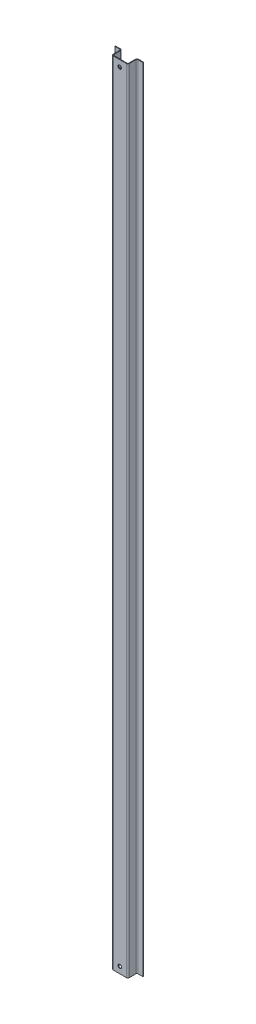
ISO-10303-21;
HEADER;
FILE_DESCRIPTION(('STEP AP214'),'2;1');
FILE_NAME('part.step','',(''),(''),'','','');
FILE_SCHEMA(('AUTOMOTIVE_DESIGN { 1 0 10303 214 1 1 1 1 }'));
ENDSEC;
DATA;
#1=APPLICATION_CONTEXT('core data for automotive mechanical design processes');
#2=APPLICATION_PROTOCOL_DEFINITION('international standard','automotive_design',2000,#1);
#3=PRODUCT_CONTEXT('',#1,'mechanical');
#4=PRODUCT('Part','Part','',(#3));
#5=PRODUCT_RELATED_PRODUCT_CATEGORY('part','',(#4));
#6=PRODUCT_DEFINITION_FORMATION('','',#4);
#7=PRODUCT_DEFINITION_CONTEXT('part definition',#1,'design');
#8=PRODUCT_DEFINITION('design','',#6,#7);
#9=PRODUCT_DEFINITION_SHAPE('','',#8);
#10=(LENGTH_UNIT() NAMED_UNIT(*) SI_UNIT(.MILLI.,.METRE.));
#11=(NAMED_UNIT(*) PLANE_ANGLE_UNIT() SI_UNIT($,.RADIAN.));
#12=(NAMED_UNIT(*) SI_UNIT($,.STERADIAN.) SOLID_ANGLE_UNIT());
#13=UNCERTAINTY_MEASURE_WITH_UNIT(LENGTH_MEASURE(1.E-05),#10,'distance_accuracy_value','');
#14=(GEOMETRIC_REPRESENTATION_CONTEXT(3) GLOBAL_UNCERTAINTY_ASSIGNED_CONTEXT((#13)) GLOBAL_UNIT_ASSIGNED_CONTEXT((#10,
#11,#12)) REPRESENTATION_CONTEXT('',''));
#15=CARTESIAN_POINT('',(0.,0.,0.));
#16=DIRECTION('',(0.,0.,1.));
#17=DIRECTION('',(1.,0.,0.));
#18=AXIS2_PLACEMENT_3D('',#15,#16,#17);
#19=CARTESIAN_POINT('',(25.0000000000001,1221.5,-30.));
#20=DIRECTION('',(0.,1.,0.));
#21=DIRECTION('',(0.,0.,1.));
#22=AXIS2_PLACEMENT_3D('',#19,#20,#21);
#23=PLANE('',#22);
#24=DIRECTION('',(0.,0.,-1.));
#25=VECTOR('',#24,1.);
#26=CARTESIAN_POINT('',(25.0000000000001,1221.5,-30.));
#27=LINE('',#26,#25);
#28=CARTESIAN_POINT('',(25.,1221.5,-4.5));
#29=VERTEX_POINT('',#28);
#30=CARTESIAN_POINT('',(25.0000000000001,1221.5,-25.5));
#31=VERTEX_POINT('',#30);
#32=EDGE_CURVE('E422',#29,#31,#27,.T.);
#33=ORIENTED_EDGE('',*,*,#32,.T.);
#34=DIRECTION('',(-1.,0.,0.));
#35=VECTOR('',#34,1.);
#36=CARTESIAN_POINT('',(25.,1221.5,-25.5));
#37=LINE('',#36,#35);
#38=CARTESIAN_POINT('',(23.,1221.5,-25.5));
#39=VERTEX_POINT('',#38);
#40=EDGE_CURVE('E309',#31,#39,#37,.T.);
#41=ORIENTED_EDGE('',*,*,#40,.T.);
#42=DIRECTION('',(0.,0.,1.));
#43=VECTOR('',#42,1.);
#44=CARTESIAN_POINT('',(23.,1221.5,0.));
#45=LINE('',#44,#43);
#46=CARTESIAN_POINT('',(23.,1221.5,-4.50000000000001));
#47=VERTEX_POINT('',#46);
#48=EDGE_CURVE('E426',#47,#39,#45,.F.);
#49=ORIENTED_EDGE('',*,*,#48,.F.);
#50=DIRECTION('',(1.,0.,0.));
#51=VECTOR('',#50,1.);
#52=CARTESIAN_POINT('',(25.,1221.5,-4.49999999999999));
#53=LINE('',#52,#51);
#54=EDGE_CURVE('E416',#47,#29,#53,.T.);
#55=ORIENTED_EDGE('',*,*,#54,.T.);
#56=EDGE_LOOP('',(#33,#41,#49,#55));
#57=FACE_BOUND('',#56,.T.);
#58=ADVANCED_FACE('F120',(#57),#23,.T.);
#59=CARTESIAN_POINT('',(25.,0.,0.));
#60=DIRECTION('',(1.,0.,0.));
#61=DIRECTION('',(0.,0.,-1.));
#62=AXIS2_PLACEMENT_3D('',#59,#60,#61);
#63=PLANE('',#62);
#64=DIRECTION('',(0.,0.,1.));
#65=VECTOR('',#64,1.);
#66=CARTESIAN_POINT('',(25.,-1221.5,-1.99999999999999));
#67=LINE('',#66,#65);
#68=CARTESIAN_POINT('',(25.0000000000001,-1221.5,-25.5));
#69=VERTEX_POINT('',#68);
#70=CARTESIAN_POINT('',(25.,-1221.5,-4.50000000000002));
#71=VERTEX_POINT('',#70);
#72=EDGE_CURVE('E419',#69,#71,#67,.T.);
#73=ORIENTED_EDGE('',*,*,#72,.F.);
#74=DIRECTION('',(0.,1.,0.));
#75=VECTOR('',#74,1.);
#76=CARTESIAN_POINT('',(25.,1221.5,-25.5));
#77=LINE('',#76,#75);
#78=EDGE_CURVE('E144',#31,#69,#77,.F.);
#79=ORIENTED_EDGE('',*,*,#78,.F.);
#80=ORIENTED_EDGE('',*,*,#32,.F.);
#81=DIRECTION('',(0.,-1.,0.));
#82=VECTOR('',#81,1.);
#83=CARTESIAN_POINT('',(25.,0.,-4.5));
#84=LINE('',#83,#82);
#85=EDGE_CURVE('E429',#29,#71,#84,.T.);
#86=ORIENTED_EDGE('',*,*,#85,.T.);
#87=EDGE_LOOP('',(#73,#79,#80,#86));
#88=FACE_BOUND('',#87,.T.);
#89=ADVANCED_FACE('F516',(#88),#63,.T.);
#90=CARTESIAN_POINT('',(23.,0.,0.));
#91=DIRECTION('',(1.,0.,0.));
#92=DIRECTION('',(0.,0.,-1.));
#93=AXIS2_PLACEMENT_3D('',#90,#91,#92);
#94=PLANE('',#93);
#95=DIRECTION('',(0.,1.,0.));
#96=VECTOR('',#95,1.);
#97=CARTESIAN_POINT('',(23.,1221.5,-25.5));
#98=LINE('',#97,#96);
#99=CARTESIAN_POINT('',(23.0000000000001,-1221.5,-25.5));
#100=VERTEX_POINT('',#99);
#101=EDGE_CURVE('E303',#39,#100,#98,.F.);
#102=ORIENTED_EDGE('',*,*,#101,.T.);
#103=DIRECTION('',(0.,0.,-1.));
#104=VECTOR('',#103,1.);
#105=CARTESIAN_POINT('',(23.,-1221.5,0.));
#106=LINE('',#105,#104);
#107=CARTESIAN_POINT('',(23.,-1221.5,-4.50000000000001));
#108=VERTEX_POINT('',#107);
#109=EDGE_CURVE('E424',#100,#108,#106,.F.);
#110=ORIENTED_EDGE('',*,*,#109,.T.);
#111=DIRECTION('',(0.,1.,0.));
#112=VECTOR('',#111,1.);
#113=CARTESIAN_POINT('',(23.,1221.5,-4.49999999999999));
#114=LINE('',#113,#112);
#115=EDGE_CURVE('E435',#47,#108,#114,.F.);
#116=ORIENTED_EDGE('',*,*,#115,.F.);
#117=ORIENTED_EDGE('',*,*,#48,.T.);
#118=EDGE_LOOP('',(#102,#110,#116,#117));
#119=FACE_BOUND('',#118,.T.);
#120=ADVANCED_FACE('F497',(#119),#94,.F.);
#121=CARTESIAN_POINT('',(-25.0000000000001,-1221.5,-30.));
#122=DIRECTION('',(0.,-1.,0.));
#123=DIRECTION('',(0.,0.,-1.));
#124=AXIS2_PLACEMENT_3D('',#121,#122,#123);
#125=PLANE('',#124);
#126=DIRECTION('',(0.,0.,-1.));
#127=VECTOR('',#126,1.);
#128=CARTESIAN_POINT('',(-25.0000000000001,-1221.5,-30.));
#129=LINE('',#128,#127);
#130=CARTESIAN_POINT('',(-25.,-1221.5,-4.49999999999997));
#131=VERTEX_POINT('',#130);
#132=CARTESIAN_POINT('',(-25.0000000000001,-1221.5,-25.5));
#133=VERTEX_POINT('',#132);
#134=EDGE_CURVE('E377',#131,#133,#129,.T.);
#135=ORIENTED_EDGE('',*,*,#134,.T.);
#136=DIRECTION('',(1.,0.,0.));
#137=VECTOR('',#136,1.);
#138=CARTESIAN_POINT('',(-25.0000000000001,-1221.5,-25.5));
#139=LINE('',#138,#137);
#140=CARTESIAN_POINT('',(-23.0000000000001,-1221.5,-25.5));
#141=VERTEX_POINT('',#140);
#142=EDGE_CURVE('E358',#133,#141,#139,.T.);
#143=ORIENTED_EDGE('',*,*,#142,.T.);
#144=DIRECTION('',(0.,0.,1.));
#145=VECTOR('',#144,1.);
#146=CARTESIAN_POINT('',(-23.,-1221.5,0.));
#147=LINE('',#146,#145);
#148=CARTESIAN_POINT('',(-23.,-1221.5,-4.49999999999998));
#149=VERTEX_POINT('',#148);
#150=EDGE_CURVE('E382',#149,#141,#147,.F.);
#151=ORIENTED_EDGE('',*,*,#150,.F.);
#152=DIRECTION('',(-1.,0.,0.));
#153=VECTOR('',#152,1.);
#154=CARTESIAN_POINT('',(-25.,-1221.5,-4.49999999999999));
#155=LINE('',#154,#153);
#156=EDGE_CURVE('E372',#149,#131,#155,.T.);
#157=ORIENTED_EDGE('',*,*,#156,.T.);
#158=EDGE_LOOP('',(#135,#143,#151,#157));
#159=FACE_BOUND('',#158,.T.);
#160=ADVANCED_FACE('F574',(#159),#125,.T.);
#161=CARTESIAN_POINT('',(-25.,0.,0.));
#162=DIRECTION('',(-1.,0.,0.));
#163=DIRECTION('',(0.,0.,1.));
#164=AXIS2_PLACEMENT_3D('',#161,#162,#163);
#165=PLANE('',#164);
#166=DIRECTION('',(0.,0.,1.));
#167=VECTOR('',#166,1.);
#168=CARTESIAN_POINT('',(-25.,1221.5,-1.99999999999999));
#169=LINE('',#168,#167);
#170=CARTESIAN_POINT('',(-25.0000000000001,1221.5,-25.5));
#171=VERTEX_POINT('',#170);
#172=CARTESIAN_POINT('',(-25.,1221.5,-4.49999999999995));
#173=VERTEX_POINT('',#172);
#174=EDGE_CURVE('E374',#171,#173,#169,.T.);
#175=ORIENTED_EDGE('',*,*,#174,.F.);
#176=DIRECTION('',(0.,-1.,0.));
#177=VECTOR('',#176,1.);
#178=CARTESIAN_POINT('',(-25.0000000000001,-1221.5,-25.5));
#179=LINE('',#178,#177);
#180=EDGE_CURVE('E364',#133,#171,#179,.F.);
#181=ORIENTED_EDGE('',*,*,#180,.F.);
#182=ORIENTED_EDGE('',*,*,#134,.F.);
#183=DIRECTION('',(0.,1.,0.));
#184=VECTOR('',#183,1.);
#185=CARTESIAN_POINT('',(-25.,0.,-4.49999999999997));
#186=LINE('',#185,#184);
#187=EDGE_CURVE('E385',#131,#173,#186,.T.);
#188=ORIENTED_EDGE('',*,*,#187,.T.);
#189=EDGE_LOOP('',(#175,#181,#182,#188));
#190=FACE_BOUND('',#189,.T.);
#191=ADVANCED_FACE('F578',(#190),#165,.T.);
#192=CARTESIAN_POINT('',(-23.,0.,0.));
#193=DIRECTION('',(-1.,0.,0.));
#194=DIRECTION('',(0.,0.,1.));
#195=AXIS2_PLACEMENT_3D('',#192,#193,#194);
#196=PLANE('',#195);
#197=DIRECTION('',(0.,-1.,0.));
#198=VECTOR('',#197,1.);
#199=CARTESIAN_POINT('',(-23.0000000000001,-1221.5,-25.5));
#200=LINE('',#199,#198);
#201=CARTESIAN_POINT('',(-23.0000000000001,1221.5,-25.5));
#202=VERTEX_POINT('',#201);
#203=EDGE_CURVE('E352',#141,#202,#200,.F.);
#204=ORIENTED_EDGE('',*,*,#203,.T.);
#205=DIRECTION('',(0.,0.,-1.));
#206=VECTOR('',#205,1.);
#207=CARTESIAN_POINT('',(-23.,1221.5,0.));
#208=LINE('',#207,#206);
#209=CARTESIAN_POINT('',(-23.,1221.5,-4.49999999999998));
#210=VERTEX_POINT('',#209);
#211=EDGE_CURVE('E380',#202,#210,#208,.F.);
#212=ORIENTED_EDGE('',*,*,#211,.T.);
#213=DIRECTION('',(0.,-1.,0.));
#214=VECTOR('',#213,1.);
#215=CARTESIAN_POINT('',(-23.,-1221.5,-4.49999999999999));
#216=LINE('',#215,#214);
#217=EDGE_CURVE('E391',#149,#210,#216,.F.);
#218=ORIENTED_EDGE('',*,*,#217,.F.);
#219=ORIENTED_EDGE('',*,*,#150,.T.);
#220=EDGE_LOOP('',(#204,#212,#218,#219));
#221=FACE_BOUND('',#220,.T.);
#222=ADVANCED_FACE('F547',(#221),#196,.F.);
#223=CARTESIAN_POINT('',(0.,0.,-2.));
#224=DIRECTION('',(0.,0.,-1.));
#225=DIRECTION('',(-1.,0.,0.));
#226=AXIS2_PLACEMENT_3D('',#223,#224,#225);
#227=PLANE('',#226);
#228=CARTESIAN_POINT('',(0.,-1201.5,-2.));
#229=DIRECTION('',(0.,0.,1.));
#230=DIRECTION('',(-1.,0.,0.));
#231=AXIS2_PLACEMENT_3D('',#228,#229,#230);
#232=CIRCLE('',#231,5.49999999999994);
#233=CARTESIAN_POINT('',(-5.49999999999994,-1201.5,-1.99999999999996));
#234=VERTEX_POINT('',#233);
#235=EDGE_CURVE('E476',#234,#234,#232,.T.);
#236=ORIENTED_EDGE('',*,*,#235,.T.);
#237=EDGE_LOOP('',(#236));
#238=FACE_BOUND('',#237,.T.);
#239=CARTESIAN_POINT('',(0.,1201.5,-2.));
#240=DIRECTION('',(0.,0.,-1.));
#241=DIRECTION('',(-1.,0.,0.));
#242=AXIS2_PLACEMENT_3D('',#239,#240,#241);
#243=CIRCLE('',#242,5.49999999999994);
#244=CARTESIAN_POINT('',(-5.49999999999994,1201.5,-1.99999999999996));
#245=VERTEX_POINT('',#244);
#246=EDGE_CURVE('E468',#245,#245,#243,.T.);
#247=ORIENTED_EDGE('',*,*,#246,.F.);
#248=EDGE_LOOP('',(#247));
#249=FACE_BOUND('',#248,.T.);
#250=DIRECTION('',(1.,0.,0.));
#251=VECTOR('',#250,1.);
#252=CARTESIAN_POINT('',(-25.,-1221.5,-2.));
#253=LINE('',#252,#251);
#254=CARTESIAN_POINT('',(-20.5,-1221.5,-1.99999999999999));
#255=VERTEX_POINT('',#254);
#256=CARTESIAN_POINT('',(20.5,-1221.5,-2.));
#257=VERTEX_POINT('',#256);
#258=EDGE_CURVE('E13',#255,#257,#253,.T.);
#259=ORIENTED_EDGE('',*,*,#258,.F.);
#260=DIRECTION('',(0.,1.,0.));
#261=VECTOR('',#260,1.);
#262=CARTESIAN_POINT('',(-20.5,1221.5,-1.99999999999999));
#263=LINE('',#262,#261);
#264=CARTESIAN_POINT('',(-20.5,1221.5,-1.99999999999999));
#265=VERTEX_POINT('',#264);
#266=EDGE_CURVE('E408',#265,#255,#263,.F.);
#267=ORIENTED_EDGE('',*,*,#266,.F.);
#268=DIRECTION('',(-1.,0.,0.));
#269=VECTOR('',#268,1.);
#270=CARTESIAN_POINT('',(-25.,1221.5,-2.));
#271=LINE('',#270,#269);
#272=CARTESIAN_POINT('',(20.5,1221.5,-2.));
#273=VERTEX_POINT('',#272);
#274=EDGE_CURVE('E129',#273,#265,#271,.T.);
#275=ORIENTED_EDGE('',*,*,#274,.F.);
#276=DIRECTION('',(0.,-1.,0.));
#277=VECTOR('',#276,1.);
#278=CARTESIAN_POINT('',(20.5,-1221.5,-2.00000000000002));
#279=LINE('',#278,#277);
#280=EDGE_CURVE('E452',#257,#273,#279,.F.);
#281=ORIENTED_EDGE('',*,*,#280,.F.);
#282=EDGE_LOOP('',(#259,#267,#275,#281));
#283=FACE_BOUND('',#282,.T.);
#284=ADVANCED_FACE('F543',(#238,#249,#283),#227,.T.);
#285=CARTESIAN_POINT('',(0.,0.,0.));
#286=DIRECTION('',(0.,0.,-1.));
#287=DIRECTION('',(-1.,0.,0.));
#288=AXIS2_PLACEMENT_3D('',#285,#286,#287);
#289=PLANE('',#288);
#290=CARTESIAN_POINT('',(0.,-1201.5,0.));
#291=DIRECTION('',(0.,0.,-1.));
#292=DIRECTION('',(-1.,0.,0.));
#293=AXIS2_PLACEMENT_3D('',#290,#291,#292);
#294=CIRCLE('',#293,5.49999999999994);
#295=CARTESIAN_POINT('',(-5.49999999999992,-1201.5,0.));
#296=VERTEX_POINT('',#295);
#297=EDGE_CURVE('E124',#296,#296,#294,.F.);
#298=ORIENTED_EDGE('',*,*,#297,.F.);
#299=EDGE_LOOP('',(#298));
#300=FACE_BOUND('',#299,.T.);
#301=CARTESIAN_POINT('',(0.,1201.5,0.));
#302=DIRECTION('',(0.,0.,-1.));
#303=DIRECTION('',(-1.,0.,0.));
#304=AXIS2_PLACEMENT_3D('',#301,#302,#303);
#305=CIRCLE('',#304,5.49999999999994);
#306=CARTESIAN_POINT('',(-5.49999999999992,1201.5,0.));
#307=VERTEX_POINT('',#306);
#308=EDGE_CURVE('E302',#307,#307,#305,.T.);
#309=ORIENTED_EDGE('',*,*,#308,.T.);
#310=EDGE_LOOP('',(#309));
#311=FACE_BOUND('',#310,.T.);
#312=DIRECTION('',(0.,1.,0.));
#313=VECTOR('',#312,1.);
#314=CARTESIAN_POINT('',(-20.5,1221.5,0.));
#315=LINE('',#314,#313);
#316=CARTESIAN_POINT('',(-20.5,1221.5,0.));
#317=VERTEX_POINT('',#316);
#318=CARTESIAN_POINT('',(-20.5,-1221.5,0.));
#319=VERTEX_POINT('',#318);
#320=EDGE_CURVE('E396',#317,#319,#315,.F.);
#321=ORIENTED_EDGE('',*,*,#320,.T.);
#322=DIRECTION('',(1.,0.,0.));
#323=VECTOR('',#322,1.);
#324=CARTESIAN_POINT('',(-25.,-1221.5,0.));
#325=LINE('',#324,#323);
#326=CARTESIAN_POINT('',(20.5,-1221.5,0.));
#327=VERTEX_POINT('',#326);
#328=EDGE_CURVE('E463',#319,#327,#325,.T.);
#329=ORIENTED_EDGE('',*,*,#328,.T.);
#330=DIRECTION('',(0.,-1.,0.));
#331=VECTOR('',#330,1.);
#332=CARTESIAN_POINT('',(20.5,-1221.5,0.));
#333=LINE('',#332,#331);
#334=CARTESIAN_POINT('',(20.5,1221.5,0.));
#335=VERTEX_POINT('',#334);
#336=EDGE_CURVE('E440',#327,#335,#333,.F.);
#337=ORIENTED_EDGE('',*,*,#336,.T.);
#338=DIRECTION('',(-1.,0.,0.));
#339=VECTOR('',#338,1.);
#340=CARTESIAN_POINT('',(-25.,1221.5,0.));
#341=LINE('',#340,#339);
#342=EDGE_CURVE('E460',#335,#317,#341,.T.);
#343=ORIENTED_EDGE('',*,*,#342,.T.);
#344=EDGE_LOOP('',(#321,#329,#337,#343));
#345=FACE_BOUND('',#344,.T.);
#346=ADVANCED_FACE('F546',(#300,#311,#345),#289,.F.);
#347=CARTESIAN_POINT('',(-25.,1221.5,-2.));
#348=DIRECTION('',(0.,1.,0.));
#349=DIRECTION('',(0.,0.,1.));
#350=AXIS2_PLACEMENT_3D('',#347,#348,#349);
#351=PLANE('',#350);
#352=ORIENTED_EDGE('',*,*,#274,.T.);
#353=DIRECTION('',(0.,0.,1.));
#354=VECTOR('',#353,1.);
#355=CARTESIAN_POINT('',(-20.5,1221.5,-1.99999999999999));
#356=LINE('',#355,#354);
#357=EDGE_CURVE('E402',#265,#317,#356,.T.);
#358=ORIENTED_EDGE('',*,*,#357,.T.);
#359=ORIENTED_EDGE('',*,*,#342,.F.);
#360=DIRECTION('',(0.,0.,1.));
#361=VECTOR('',#360,1.);
#362=CARTESIAN_POINT('',(20.5,1221.5,-2.00000000000002));
#363=LINE('',#362,#361);
#364=EDGE_CURVE('E457',#273,#335,#363,.T.);
#365=ORIENTED_EDGE('',*,*,#364,.F.);
#366=EDGE_LOOP('',(#352,#358,#359,#365));
#367=FACE_BOUND('',#366,.T.);
#368=ADVANCED_FACE('F122',(#367),#351,.T.);
#369=CARTESIAN_POINT('',(-25.,-1221.5,-2.));
#370=DIRECTION('',(0.,-1.,0.));
#371=DIRECTION('',(0.,0.,-1.));
#372=AXIS2_PLACEMENT_3D('',#369,#370,#371);
#373=PLANE('',#372);
#374=DIRECTION('',(0.,0.,1.));
#375=VECTOR('',#374,1.);
#376=CARTESIAN_POINT('',(-20.5,-1221.5,-1.99999999999999));
#377=LINE('',#376,#375);
#378=EDGE_CURVE('E413',#255,#319,#377,.T.);
#379=ORIENTED_EDGE('',*,*,#378,.F.);
#380=ORIENTED_EDGE('',*,*,#258,.T.);
#381=DIRECTION('',(0.,0.,1.));
#382=VECTOR('',#381,1.);
#383=CARTESIAN_POINT('',(20.5,-1221.5,-2.00000000000002));
#384=LINE('',#383,#382);
#385=EDGE_CURVE('E446',#257,#327,#384,.T.);
#386=ORIENTED_EDGE('',*,*,#385,.T.);
#387=ORIENTED_EDGE('',*,*,#328,.F.);
#388=EDGE_LOOP('',(#379,#380,#386,#387));
#389=FACE_BOUND('',#388,.T.);
#390=ADVANCED_FACE('F538',(#389),#373,.T.);
#391=CARTESIAN_POINT('',(20.5,1221.5,-4.50000000000002));
#392=DIRECTION('',(0.,1.,0.));
#393=DIRECTION('',(0.,0.,1.));
#394=AXIS2_PLACEMENT_3D('',#391,#392,#393);
#395=PLANE('',#394);
#396=ORIENTED_EDGE('',*,*,#54,.F.);
#397=CARTESIAN_POINT('',(20.5,1221.5,-4.50000000000002));
#398=DIRECTION('',(0.,-1.,0.));
#399=DIRECTION('',(0.,0.,-1.));
#400=AXIS2_PLACEMENT_3D('',#397,#398,#399);
#401=CIRCLE('',#400,2.5);
#402=EDGE_CURVE('E449',#273,#47,#401,.F.);
#403=ORIENTED_EDGE('',*,*,#402,.F.);
#404=ORIENTED_EDGE('',*,*,#364,.T.);
#405=CARTESIAN_POINT('',(20.5,1221.5,-4.50000000000002));
#406=DIRECTION('',(0.,-1.,0.));
#407=DIRECTION('',(0.,0.,-1.));
#408=AXIS2_PLACEMENT_3D('',#405,#406,#407);
#409=CIRCLE('',#408,4.5);
#410=EDGE_CURVE('E442',#335,#29,#409,.F.);
#411=ORIENTED_EDGE('',*,*,#410,.T.);
#412=EDGE_LOOP('',(#396,#403,#404,#411));
#413=FACE_BOUND('',#412,.T.);
#414=ADVANCED_FACE('F535',(#413),#395,.T.);
#415=CARTESIAN_POINT('',(20.5,-1221.5,-4.50000000000002));
#416=DIRECTION('',(0.,1.,0.));
#417=DIRECTION('',(0.,0.,1.));
#418=AXIS2_PLACEMENT_3D('',#415,#416,#417);
#419=PLANE('',#418);
#420=CARTESIAN_POINT('',(20.5,-1221.5,-4.50000000000002));
#421=DIRECTION('',(0.,-1.,0.));
#422=DIRECTION('',(0.,0.,-1.));
#423=AXIS2_PLACEMENT_3D('',#420,#421,#422);
#424=CIRCLE('',#423,2.5);
#425=EDGE_CURVE('E421',#108,#257,#424,.T.);
#426=ORIENTED_EDGE('',*,*,#425,.F.);
#427=DIRECTION('',(1.,0.,0.));
#428=VECTOR('',#427,1.);
#429=CARTESIAN_POINT('',(23.,-1221.5,-4.50000000000003));
#430=LINE('',#429,#428);
#431=EDGE_CURVE('E432',#108,#71,#430,.T.);
#432=ORIENTED_EDGE('',*,*,#431,.T.);
#433=CARTESIAN_POINT('',(20.5,-1221.5,-4.50000000000002));
#434=DIRECTION('',(0.,-1.,0.));
#435=DIRECTION('',(0.,0.,-1.));
#436=AXIS2_PLACEMENT_3D('',#433,#434,#435);
#437=CIRCLE('',#436,4.5);
#438=EDGE_CURVE('E443',#71,#327,#437,.T.);
#439=ORIENTED_EDGE('',*,*,#438,.T.);
#440=ORIENTED_EDGE('',*,*,#385,.F.);
#441=EDGE_LOOP('',(#426,#432,#439,#440));
#442=FACE_BOUND('',#441,.T.);
#443=ADVANCED_FACE('F530',(#442),#419,.F.);
#444=CARTESIAN_POINT('',(20.5,-1221.5,-4.50000000000002));
#445=DIRECTION('',(0.,-1.,0.));
#446=DIRECTION('',(1.,0.,0.));
#447=AXIS2_PLACEMENT_3D('',#444,#445,#446);
#448=CYLINDRICAL_SURFACE('',#447,4.5);
#449=ORIENTED_EDGE('',*,*,#336,.F.);
#450=ORIENTED_EDGE('',*,*,#438,.F.);
#451=ORIENTED_EDGE('',*,*,#85,.F.);
#452=ORIENTED_EDGE('',*,*,#410,.F.);
#453=EDGE_LOOP('',(#449,#450,#451,#452));
#454=FACE_BOUND('',#453,.T.);
#455=ADVANCED_FACE('F526',(#454),#448,.T.);
#456=CARTESIAN_POINT('',(20.5,-1221.5,-4.50000000000002));
#457=DIRECTION('',(0.,-1.,0.));
#458=DIRECTION('',(1.,0.,0.));
#459=AXIS2_PLACEMENT_3D('',#456,#457,#458);
#460=CYLINDRICAL_SURFACE('',#459,2.5);
#461=ORIENTED_EDGE('',*,*,#280,.T.);
#462=ORIENTED_EDGE('',*,*,#402,.T.);
#463=ORIENTED_EDGE('',*,*,#115,.T.);
#464=ORIENTED_EDGE('',*,*,#425,.T.);
#465=EDGE_LOOP('',(#461,#462,#463,#464));
#466=FACE_BOUND('',#465,.T.);
#467=ADVANCED_FACE('F529',(#466),#460,.F.);
#468=CARTESIAN_POINT('',(25.,-1221.5,-1.99999999999999));
#469=DIRECTION('',(0.,-1.,0.));
#470=DIRECTION('',(0.,0.,-1.));
#471=AXIS2_PLACEMENT_3D('',#468,#469,#470);
#472=PLANE('',#471);
#473=DIRECTION('',(-1.,0.,0.));
#474=VECTOR('',#473,1.);
#475=CARTESIAN_POINT('',(25.,-1221.5,-25.5));
#476=LINE('',#475,#474);
#477=EDGE_CURVE('E137',#69,#100,#476,.T.);
#478=ORIENTED_EDGE('',*,*,#477,.F.);
#479=ORIENTED_EDGE('',*,*,#72,.T.);
#480=ORIENTED_EDGE('',*,*,#431,.F.);
#481=ORIENTED_EDGE('',*,*,#109,.F.);
#482=EDGE_LOOP('',(#478,#479,#480,#481));
#483=FACE_BOUND('',#482,.T.);
#484=ADVANCED_FACE('F524',(#483),#472,.T.);
#485=CARTESIAN_POINT('',(-20.5,-1221.5,-4.49999999999998));
#486=DIRECTION('',(0.,-1.,0.));
#487=DIRECTION('',(0.,0.,-1.));
#488=AXIS2_PLACEMENT_3D('',#485,#486,#487);
#489=PLANE('',#488);
#490=ORIENTED_EDGE('',*,*,#156,.F.);
#491=CARTESIAN_POINT('',(-20.5,-1221.5,-4.49999999999998));
#492=DIRECTION('',(0.,1.,0.));
#493=DIRECTION('',(0.,0.,1.));
#494=AXIS2_PLACEMENT_3D('',#491,#492,#493);
#495=CIRCLE('',#494,2.5);
#496=EDGE_CURVE('E405',#255,#149,#495,.F.);
#497=ORIENTED_EDGE('',*,*,#496,.F.);
#498=ORIENTED_EDGE('',*,*,#378,.T.);
#499=CARTESIAN_POINT('',(-20.5,-1221.5,-4.49999999999998));
#500=DIRECTION('',(0.,1.,0.));
#501=DIRECTION('',(0.,0.,1.));
#502=AXIS2_PLACEMENT_3D('',#499,#500,#501);
#503=CIRCLE('',#502,4.5);
#504=EDGE_CURVE('E398',#319,#131,#503,.F.);
#505=ORIENTED_EDGE('',*,*,#504,.T.);
#506=EDGE_LOOP('',(#490,#497,#498,#505));
#507=FACE_BOUND('',#506,.T.);
#508=ADVANCED_FACE('F570',(#507),#489,.T.);
#509=CARTESIAN_POINT('',(-20.5,1221.5,-4.49999999999998));
#510=DIRECTION('',(0.,-1.,0.));
#511=DIRECTION('',(0.,0.,-1.));
#512=AXIS2_PLACEMENT_3D('',#509,#510,#511);
#513=PLANE('',#512);
#514=CARTESIAN_POINT('',(-20.5,1221.5,-4.49999999999998));
#515=DIRECTION('',(0.,1.,0.));
#516=DIRECTION('',(0.,0.,1.));
#517=AXIS2_PLACEMENT_3D('',#514,#515,#516);
#518=CIRCLE('',#517,2.5);
#519=EDGE_CURVE('E376',#210,#265,#518,.T.);
#520=ORIENTED_EDGE('',*,*,#519,.F.);
#521=DIRECTION('',(-1.,0.,0.));
#522=VECTOR('',#521,1.);
#523=CARTESIAN_POINT('',(-23.,1221.5,-4.49999999999996));
#524=LINE('',#523,#522);
#525=EDGE_CURVE('E388',#210,#173,#524,.T.);
#526=ORIENTED_EDGE('',*,*,#525,.T.);
#527=CARTESIAN_POINT('',(-20.5,1221.5,-4.49999999999998));
#528=DIRECTION('',(0.,1.,0.));
#529=DIRECTION('',(0.,0.,1.));
#530=AXIS2_PLACEMENT_3D('',#527,#528,#529);
#531=CIRCLE('',#530,4.5);
#532=EDGE_CURVE('E399',#173,#317,#531,.T.);
#533=ORIENTED_EDGE('',*,*,#532,.T.);
#534=ORIENTED_EDGE('',*,*,#357,.F.);
#535=EDGE_LOOP('',(#520,#526,#533,#534));
#536=FACE_BOUND('',#535,.T.);
#537=ADVANCED_FACE('F637',(#536),#513,.F.);
#538=CARTESIAN_POINT('',(-20.5,1221.5,-4.49999999999998));
#539=DIRECTION('',(0.,1.,0.));
#540=DIRECTION('',(-1.,0.,0.));
#541=AXIS2_PLACEMENT_3D('',#538,#539,#540);
#542=CYLINDRICAL_SURFACE('',#541,4.5);
#543=ORIENTED_EDGE('',*,*,#320,.F.);
#544=ORIENTED_EDGE('',*,*,#532,.F.);
#545=ORIENTED_EDGE('',*,*,#187,.F.);
#546=ORIENTED_EDGE('',*,*,#504,.F.);
#547=EDGE_LOOP('',(#543,#544,#545,#546));
#548=FACE_BOUND('',#547,.T.);
#549=ADVANCED_FACE('F634',(#548),#542,.T.);
#550=CARTESIAN_POINT('',(-20.5,1221.5,-4.49999999999998));
#551=DIRECTION('',(0.,1.,0.));
#552=DIRECTION('',(-1.,0.,0.));
#553=AXIS2_PLACEMENT_3D('',#550,#551,#552);
#554=CYLINDRICAL_SURFACE('',#553,2.5);
#555=ORIENTED_EDGE('',*,*,#266,.T.);
#556=ORIENTED_EDGE('',*,*,#496,.T.);
#557=ORIENTED_EDGE('',*,*,#217,.T.);
#558=ORIENTED_EDGE('',*,*,#519,.T.);
#559=EDGE_LOOP('',(#555,#556,#557,#558));
#560=FACE_BOUND('',#559,.T.);
#561=ADVANCED_FACE('F567',(#560),#554,.F.);
#562=CARTESIAN_POINT('',(-25.,1221.5,-1.99999999999999));
#563=DIRECTION('',(0.,1.,0.));
#564=DIRECTION('',(0.,0.,1.));
#565=AXIS2_PLACEMENT_3D('',#562,#563,#564);
#566=PLANE('',#565);
#567=DIRECTION('',(1.,0.,0.));
#568=VECTOR('',#567,1.);
#569=CARTESIAN_POINT('',(-25.0000000000001,1221.5,-25.5));
#570=LINE('',#569,#568);
#571=EDGE_CURVE('E369',#171,#202,#570,.T.);
#572=ORIENTED_EDGE('',*,*,#571,.F.);
#573=ORIENTED_EDGE('',*,*,#174,.T.);
#574=ORIENTED_EDGE('',*,*,#525,.F.);
#575=ORIENTED_EDGE('',*,*,#211,.F.);
#576=EDGE_LOOP('',(#572,#573,#574,#575));
#577=FACE_BOUND('',#576,.T.);
#578=ADVANCED_FACE('F621',(#577),#566,.T.);
#579=CARTESIAN_POINT('',(-27.5000000000001,1221.5,-25.5));
#580=DIRECTION('',(0.,1.,0.));
#581=DIRECTION('',(0.,0.,1.));
#582=AXIS2_PLACEMENT_3D('',#579,#580,#581);
#583=PLANE('',#582);
#584=DIRECTION('',(0.,0.,1.));
#585=VECTOR('',#584,1.);
#586=CARTESIAN_POINT('',(-27.5000000000001,1221.5,-30.));
#587=LINE('',#586,#585);
#588=CARTESIAN_POINT('',(-27.5000000000001,1221.5,-28.));
#589=VERTEX_POINT('',#588);
#590=CARTESIAN_POINT('',(-27.5000000000001,1221.5,-30.));
#591=VERTEX_POINT('',#590);
#592=EDGE_CURVE('E320',#589,#591,#587,.F.);
#593=ORIENTED_EDGE('',*,*,#592,.F.);
#594=CARTESIAN_POINT('',(-27.5000000000001,1221.5,-25.5));
#595=DIRECTION('',(0.,-1.,0.));
#596=DIRECTION('',(0.,0.,-1.));
#597=AXIS2_PLACEMENT_3D('',#594,#595,#596);
#598=CIRCLE('',#597,2.5);
#599=EDGE_CURVE('E361',#171,#589,#598,.F.);
#600=ORIENTED_EDGE('',*,*,#599,.F.);
#601=ORIENTED_EDGE('',*,*,#571,.T.);
#602=CARTESIAN_POINT('',(-27.5000000000001,1221.5,-25.5));
#603=DIRECTION('',(0.,-1.,0.));
#604=DIRECTION('',(0.,0.,-1.));
#605=AXIS2_PLACEMENT_3D('',#602,#603,#604);
#606=CIRCLE('',#605,4.5);
#607=EDGE_CURVE('E354',#202,#591,#606,.F.);
#608=ORIENTED_EDGE('',*,*,#607,.T.);
#609=EDGE_LOOP('',(#593,#600,#601,#608));
#610=FACE_BOUND('',#609,.T.);
#611=ADVANCED_FACE('F585',(#610),#583,.T.);
#612=CARTESIAN_POINT('',(-27.5000000000001,-1221.5,-25.5));
#613=DIRECTION('',(0.,1.,0.));
#614=DIRECTION('',(0.,0.,1.));
#615=AXIS2_PLACEMENT_3D('',#612,#613,#614);
#616=PLANE('',#615);
#617=CARTESIAN_POINT('',(-27.5000000000001,-1221.5,-25.5));
#618=DIRECTION('',(0.,-1.,0.));
#619=DIRECTION('',(0.,0.,-1.));
#620=AXIS2_PLACEMENT_3D('',#617,#618,#619);
#621=CIRCLE('',#620,2.5);
#622=CARTESIAN_POINT('',(-27.5000000000001,-1221.5,-28.));
#623=VERTEX_POINT('',#622);
#624=EDGE_CURVE('E325',#623,#133,#621,.T.);
#625=ORIENTED_EDGE('',*,*,#624,.F.);
#626=DIRECTION('',(0.,0.,1.));
#627=VECTOR('',#626,1.);
#628=CARTESIAN_POINT('',(-27.5000000000002,-1221.5,-28.));
#629=LINE('',#628,#627);
#630=CARTESIAN_POINT('',(-27.5000000000002,-1221.5,-30.));
#631=VERTEX_POINT('',#630);
#632=EDGE_CURVE('E345',#623,#631,#629,.F.);
#633=ORIENTED_EDGE('',*,*,#632,.T.);
#634=CARTESIAN_POINT('',(-27.5000000000001,-1221.5,-25.5));
#635=DIRECTION('',(0.,-1.,0.));
#636=DIRECTION('',(0.,0.,-1.));
#637=AXIS2_PLACEMENT_3D('',#634,#635,#636);
#638=CIRCLE('',#637,4.5);
#639=EDGE_CURVE('E355',#631,#141,#638,.T.);
#640=ORIENTED_EDGE('',*,*,#639,.T.);
#641=ORIENTED_EDGE('',*,*,#142,.F.);
#642=EDGE_LOOP('',(#625,#633,#640,#641));
#643=FACE_BOUND('',#642,.T.);
#644=ADVANCED_FACE('F603',(#643),#616,.F.);
#645=CARTESIAN_POINT('',(-27.5000000000001,-1221.5,-25.5));
#646=DIRECTION('',(0.,-1.,0.));
#647=DIRECTION('',(0.,0.,-1.));
#648=AXIS2_PLACEMENT_3D('',#645,#646,#647);
#649=CYLINDRICAL_SURFACE('',#648,4.5);
#650=ORIENTED_EDGE('',*,*,#203,.F.);
#651=ORIENTED_EDGE('',*,*,#639,.F.);
#652=DIRECTION('',(0.,-1.,0.));
#653=VECTOR('',#652,1.);
#654=CARTESIAN_POINT('',(-27.5000000000001,1221.5,-30.));
#655=LINE('',#654,#653);
#656=EDGE_CURVE('E343',#631,#591,#655,.F.);
#657=ORIENTED_EDGE('',*,*,#656,.T.);
#658=ORIENTED_EDGE('',*,*,#607,.F.);
#659=EDGE_LOOP('',(#650,#651,#657,#658));
#660=FACE_BOUND('',#659,.T.);
#661=ADVANCED_FACE('F613',(#660),#649,.T.);
#662=CARTESIAN_POINT('',(-27.5000000000001,-1221.5,-25.5));
#663=DIRECTION('',(0.,-1.,0.));
#664=DIRECTION('',(0.,0.,-1.));
#665=AXIS2_PLACEMENT_3D('',#662,#663,#664);
#666=CYLINDRICAL_SURFACE('',#665,2.5);
#667=ORIENTED_EDGE('',*,*,#180,.T.);
#668=ORIENTED_EDGE('',*,*,#599,.T.);
#669=DIRECTION('',(0.,-1.,0.));
#670=VECTOR('',#669,1.);
#671=CARTESIAN_POINT('',(-27.5000000000001,1221.5,-28.));
#672=LINE('',#671,#670);
#673=EDGE_CURVE('E348',#589,#623,#672,.T.);
#674=ORIENTED_EDGE('',*,*,#673,.T.);
#675=ORIENTED_EDGE('',*,*,#624,.T.);
#676=EDGE_LOOP('',(#667,#668,#674,#675));
#677=FACE_BOUND('',#676,.T.);
#678=ADVANCED_FACE('F581',(#677),#666,.F.);
#679=CARTESIAN_POINT('',(-43.0000000000001,-1221.5,-30.));
#680=DIRECTION('',(0.,1.,0.));
#681=DIRECTION('',(0.,0.,1.));
#682=AXIS2_PLACEMENT_3D('',#679,#680,#681);
#683=PLANE('',#682);
#684=ORIENTED_EDGE('',*,*,#632,.F.);
#685=DIRECTION('',(1.,0.,0.));
#686=VECTOR('',#685,1.);
#687=CARTESIAN_POINT('',(-43.0000000000001,-1221.5,-28.));
#688=LINE('',#687,#686);
#689=CARTESIAN_POINT('',(-43.0000000000001,-1221.5,-28.));
#690=VERTEX_POINT('',#689);
#691=EDGE_CURVE('E341',#623,#690,#688,.F.);
#692=ORIENTED_EDGE('',*,*,#691,.T.);
#693=DIRECTION('',(0.,0.,1.));
#694=VECTOR('',#693,1.);
#695=CARTESIAN_POINT('',(-43.0000000000001,-1221.5,-30.));
#696=LINE('',#695,#694);
#697=CARTESIAN_POINT('',(-43.0000000000001,-1221.5,-30.));
#698=VERTEX_POINT('',#697);
#699=EDGE_CURVE('E322',#698,#690,#696,.T.);
#700=ORIENTED_EDGE('',*,*,#699,.F.);
#701=DIRECTION('',(-1.,0.,0.));
#702=VECTOR('',#701,1.);
#703=CARTESIAN_POINT('',(0.,-1221.5,-30.));
#704=LINE('',#703,#702);
#705=EDGE_CURVE('E334',#631,#698,#704,.T.);
#706=ORIENTED_EDGE('',*,*,#705,.F.);
#707=EDGE_LOOP('',(#684,#692,#700,#706));
#708=FACE_BOUND('',#707,.T.);
#709=ADVANCED_FACE('F605',(#708),#683,.F.);
#710=CARTESIAN_POINT('',(-25.0000000000001,1221.5,-30.));
#711=DIRECTION('',(0.,-1.,0.));
#712=DIRECTION('',(0.,0.,-1.));
#713=AXIS2_PLACEMENT_3D('',#710,#711,#712);
#714=PLANE('',#713);
#715=ORIENTED_EDGE('',*,*,#592,.T.);
#716=DIRECTION('',(1.,0.,0.));
#717=VECTOR('',#716,1.);
#718=CARTESIAN_POINT('',(0.,1221.5,-30.));
#719=LINE('',#718,#717);
#720=CARTESIAN_POINT('',(-43.0000000000001,1221.5,-30.));
#721=VERTEX_POINT('',#720);
#722=EDGE_CURVE('E329',#721,#591,#719,.T.);
#723=ORIENTED_EDGE('',*,*,#722,.F.);
#724=DIRECTION('',(0.,0.,1.));
#725=VECTOR('',#724,1.);
#726=CARTESIAN_POINT('',(-43.0000000000001,1221.5,-30.));
#727=LINE('',#726,#725);
#728=CARTESIAN_POINT('',(-43.0000000000001,1221.5,-28.));
#729=VERTEX_POINT('',#728);
#730=EDGE_CURVE('E326',#721,#729,#727,.T.);
#731=ORIENTED_EDGE('',*,*,#730,.T.);
#732=DIRECTION('',(-1.,0.,0.));
#733=VECTOR('',#732,1.);
#734=CARTESIAN_POINT('',(-25.0000000000001,1221.5,-28.));
#735=LINE('',#734,#733);
#736=EDGE_CURVE('E336',#729,#589,#735,.F.);
#737=ORIENTED_EDGE('',*,*,#736,.T.);
#738=EDGE_LOOP('',(#715,#723,#731,#737));
#739=FACE_BOUND('',#738,.T.);
#740=ADVANCED_FACE('F589',(#739),#714,.F.);
#741=CARTESIAN_POINT('',(0.,0.,-30.));
#742=DIRECTION('',(0.,0.,1.));
#743=DIRECTION('',(1.,0.,0.));
#744=AXIS2_PLACEMENT_3D('',#741,#742,#743);
#745=PLANE('',#744);
#746=ORIENTED_EDGE('',*,*,#656,.F.);
#747=ORIENTED_EDGE('',*,*,#705,.T.);
#748=DIRECTION('',(0.,1.,0.));
#749=VECTOR('',#748,1.);
#750=CARTESIAN_POINT('',(-43.0000000000001,0.,-30.));
#751=LINE('',#750,#749);
#752=EDGE_CURVE('E332',#698,#721,#751,.T.);
#753=ORIENTED_EDGE('',*,*,#752,.T.);
#754=ORIENTED_EDGE('',*,*,#722,.T.);
#755=EDGE_LOOP('',(#746,#747,#753,#754));
#756=FACE_BOUND('',#755,.T.);
#757=ADVANCED_FACE('F593',(#756),#745,.F.);
#758=CARTESIAN_POINT('',(0.,0.,-28.));
#759=DIRECTION('',(0.,0.,1.));
#760=DIRECTION('',(1.,0.,0.));
#761=AXIS2_PLACEMENT_3D('',#758,#759,#760);
#762=PLANE('',#761);
#763=ORIENTED_EDGE('',*,*,#691,.F.);
#764=ORIENTED_EDGE('',*,*,#673,.F.);
#765=ORIENTED_EDGE('',*,*,#736,.F.);
#766=DIRECTION('',(0.,-1.,0.));
#767=VECTOR('',#766,1.);
#768=CARTESIAN_POINT('',(-43.0000000000001,1221.5,-28.));
#769=LINE('',#768,#767);
#770=EDGE_CURVE('E339',#690,#729,#769,.F.);
#771=ORIENTED_EDGE('',*,*,#770,.F.);
#772=EDGE_LOOP('',(#763,#764,#765,#771));
#773=FACE_BOUND('',#772,.T.);
#774=ADVANCED_FACE('F511',(#773),#762,.T.);
#775=CARTESIAN_POINT('',(-43.0000000000001,1221.5,-30.));
#776=DIRECTION('',(1.,0.,0.));
#777=DIRECTION('',(0.,0.,-1.));
#778=AXIS2_PLACEMENT_3D('',#775,#776,#777);
#779=PLANE('',#778);
#780=ORIENTED_EDGE('',*,*,#770,.T.);
#781=ORIENTED_EDGE('',*,*,#730,.F.);
#782=ORIENTED_EDGE('',*,*,#752,.F.);
#783=ORIENTED_EDGE('',*,*,#699,.T.);
#784=EDGE_LOOP('',(#780,#781,#782,#783));
#785=FACE_BOUND('',#784,.T.);
#786=ADVANCED_FACE('F504',(#785),#779,.F.);
#787=CARTESIAN_POINT('',(27.5,-1221.5,-25.5));
#788=DIRECTION('',(0.,-1.,0.));
#789=DIRECTION('',(0.,0.,-1.));
#790=AXIS2_PLACEMENT_3D('',#787,#788,#789);
#791=PLANE('',#790);
#792=DIRECTION('',(0.,0.,1.));
#793=VECTOR('',#792,1.);
#794=CARTESIAN_POINT('',(27.5000000000001,-1221.5,-30.));
#795=LINE('',#794,#793);
#796=CARTESIAN_POINT('',(27.5,-1221.5,-28.));
#797=VERTEX_POINT('',#796);
#798=CARTESIAN_POINT('',(27.5,-1221.5,-30.));
#799=VERTEX_POINT('',#798);
#800=EDGE_CURVE('E284',#797,#799,#795,.F.);
#801=ORIENTED_EDGE('',*,*,#800,.F.);
#802=CARTESIAN_POINT('',(27.5,-1221.5,-25.5));
#803=DIRECTION('',(0.,1.,0.));
#804=DIRECTION('',(0.,0.,1.));
#805=AXIS2_PLACEMENT_3D('',#802,#803,#804);
#806=CIRCLE('',#805,2.5);
#807=EDGE_CURVE('E312',#69,#797,#806,.F.);
#808=ORIENTED_EDGE('',*,*,#807,.F.);
#809=ORIENTED_EDGE('',*,*,#477,.T.);
#810=CARTESIAN_POINT('',(27.5,-1221.5,-25.5));
#811=DIRECTION('',(0.,1.,0.));
#812=DIRECTION('',(0.,0.,1.));
#813=AXIS2_PLACEMENT_3D('',#810,#811,#812);
#814=CIRCLE('',#813,4.5);
#815=EDGE_CURVE('E305',#100,#799,#814,.F.);
#816=ORIENTED_EDGE('',*,*,#815,.T.);
#817=EDGE_LOOP('',(#801,#808,#809,#816));
#818=FACE_BOUND('',#817,.T.);
#819=ADVANCED_FACE('F502',(#818),#791,.T.);
#820=CARTESIAN_POINT('',(27.5,1221.5,-25.5));
#821=DIRECTION('',(0.,-1.,0.));
#822=DIRECTION('',(0.,0.,-1.));
#823=AXIS2_PLACEMENT_3D('',#820,#821,#822);
#824=PLANE('',#823);
#825=CARTESIAN_POINT('',(27.5,1221.5,-25.5));
#826=DIRECTION('',(0.,1.,0.));
#827=DIRECTION('',(0.,0.,1.));
#828=AXIS2_PLACEMENT_3D('',#825,#826,#827);
#829=CIRCLE('',#828,2.5);
#830=CARTESIAN_POINT('',(27.5,1221.5,-28.));
#831=VERTEX_POINT('',#830);
#832=EDGE_CURVE('E316',#831,#31,#829,.T.);
#833=ORIENTED_EDGE('',*,*,#832,.F.);
#834=DIRECTION('',(0.,0.,1.));
#835=VECTOR('',#834,1.);
#836=CARTESIAN_POINT('',(27.5,1221.5,-28.));
#837=LINE('',#836,#835);
#838=CARTESIAN_POINT('',(27.5,1221.5,-30.));
#839=VERTEX_POINT('',#838);
#840=EDGE_CURVE('E296',#831,#839,#837,.F.);
#841=ORIENTED_EDGE('',*,*,#840,.T.);
#842=CARTESIAN_POINT('',(27.5,1221.5,-25.5));
#843=DIRECTION('',(0.,1.,0.));
#844=DIRECTION('',(0.,0.,1.));
#845=AXIS2_PLACEMENT_3D('',#842,#843,#844);
#846=CIRCLE('',#845,4.5);
#847=EDGE_CURVE('E306',#839,#39,#846,.T.);
#848=ORIENTED_EDGE('',*,*,#847,.T.);
#849=ORIENTED_EDGE('',*,*,#40,.F.);
#850=EDGE_LOOP('',(#833,#841,#848,#849));
#851=FACE_BOUND('',#850,.T.);
#852=ADVANCED_FACE('F491',(#851),#824,.F.);
#853=CARTESIAN_POINT('',(27.5,1221.5,-25.5));
#854=DIRECTION('',(0.,1.,0.));
#855=DIRECTION('',(0.,0.,-1.));
#856=AXIS2_PLACEMENT_3D('',#853,#854,#855);
#857=CYLINDRICAL_SURFACE('',#856,4.5);
#858=ORIENTED_EDGE('',*,*,#101,.F.);
#859=ORIENTED_EDGE('',*,*,#847,.F.);
#860=DIRECTION('',(0.,1.,0.));
#861=VECTOR('',#860,1.);
#862=CARTESIAN_POINT('',(27.5000000000001,-1221.5,-30.));
#863=LINE('',#862,#861);
#864=EDGE_CURVE('E294',#839,#799,#863,.F.);
#865=ORIENTED_EDGE('',*,*,#864,.T.);
#866=ORIENTED_EDGE('',*,*,#815,.F.);
#867=EDGE_LOOP('',(#858,#859,#865,#866));
#868=FACE_BOUND('',#867,.T.);
#869=ADVANCED_FACE('F500',(#868),#857,.T.);
#870=CARTESIAN_POINT('',(27.5,1221.5,-25.5));
#871=DIRECTION('',(0.,1.,0.));
#872=DIRECTION('',(0.,0.,-1.));
#873=AXIS2_PLACEMENT_3D('',#870,#871,#872);
#874=CYLINDRICAL_SURFACE('',#873,2.5);
#875=ORIENTED_EDGE('',*,*,#78,.T.);
#876=ORIENTED_EDGE('',*,*,#807,.T.);
#877=DIRECTION('',(0.,1.,0.));
#878=VECTOR('',#877,1.);
#879=CARTESIAN_POINT('',(27.5000000000001,-1221.5,-28.));
#880=LINE('',#879,#878);
#881=EDGE_CURVE('E299',#797,#831,#880,.T.);
#882=ORIENTED_EDGE('',*,*,#881,.T.);
#883=ORIENTED_EDGE('',*,*,#832,.T.);
#884=EDGE_LOOP('',(#875,#876,#882,#883));
#885=FACE_BOUND('',#884,.T.);
#886=ADVANCED_FACE('F487',(#885),#874,.F.);
#887=CARTESIAN_POINT('',(43.0000000000001,1221.5,-30.));
#888=DIRECTION('',(0.,-1.,0.));
#889=DIRECTION('',(0.,0.,-1.));
#890=AXIS2_PLACEMENT_3D('',#887,#888,#889);
#891=PLANE('',#890);
#892=ORIENTED_EDGE('',*,*,#840,.F.);
#893=DIRECTION('',(-1.,0.,0.));
#894=VECTOR('',#893,1.);
#895=CARTESIAN_POINT('',(43.0000000000001,1221.5,-28.));
#896=LINE('',#895,#894);
#897=CARTESIAN_POINT('',(43.0000000000001,1221.5,-28.));
#898=VERTEX_POINT('',#897);
#899=EDGE_CURVE('E292',#831,#898,#896,.F.);
#900=ORIENTED_EDGE('',*,*,#899,.T.);
#901=DIRECTION('',(0.,0.,1.));
#902=VECTOR('',#901,1.);
#903=CARTESIAN_POINT('',(43.0000000000001,1221.5,-30.));
#904=LINE('',#903,#902);
#905=CARTESIAN_POINT('',(43.0000000000001,1221.5,-30.));
#906=VERTEX_POINT('',#905);
#907=EDGE_CURVE('E280',#906,#898,#904,.T.);
#908=ORIENTED_EDGE('',*,*,#907,.F.);
#909=DIRECTION('',(1.,0.,0.));
#910=VECTOR('',#909,1.);
#911=CARTESIAN_POINT('',(0.,1221.5,-30.));
#912=LINE('',#911,#910);
#913=EDGE_CURVE('E267',#839,#906,#912,.T.);
#914=ORIENTED_EDGE('',*,*,#913,.F.);
#915=EDGE_LOOP('',(#892,#900,#908,#914));
#916=FACE_BOUND('',#915,.T.);
#917=ADVANCED_FACE('F480',(#916),#891,.F.);
#918=CARTESIAN_POINT('',(25.0000000000001,-1221.5,-30.));
#919=DIRECTION('',(0.,1.,0.));
#920=DIRECTION('',(0.,0.,1.));
#921=AXIS2_PLACEMENT_3D('',#918,#919,#920);
#922=PLANE('',#921);
#923=ORIENTED_EDGE('',*,*,#800,.T.);
#924=DIRECTION('',(-1.,0.,0.));
#925=VECTOR('',#924,1.);
#926=CARTESIAN_POINT('',(0.,-1221.5,-30.));
#927=LINE('',#926,#925);
#928=CARTESIAN_POINT('',(43.0000000000001,-1221.5,-30.));
#929=VERTEX_POINT('',#928);
#930=EDGE_CURVE('E265',#929,#799,#927,.T.);
#931=ORIENTED_EDGE('',*,*,#930,.F.);
#932=DIRECTION('',(0.,0.,1.));
#933=VECTOR('',#932,1.);
#934=CARTESIAN_POINT('',(43.0000000000001,-1221.5,-30.));
#935=LINE('',#934,#933);
#936=CARTESIAN_POINT('',(43.0000000000001,-1221.5,-28.));
#937=VERTEX_POINT('',#936);
#938=EDGE_CURVE('E273',#929,#937,#935,.T.);
#939=ORIENTED_EDGE('',*,*,#938,.T.);
#940=DIRECTION('',(1.,0.,0.));
#941=VECTOR('',#940,1.);
#942=CARTESIAN_POINT('',(25.0000000000001,-1221.5,-28.));
#943=LINE('',#942,#941);
#944=EDGE_CURVE('E289',#937,#797,#943,.F.);
#945=ORIENTED_EDGE('',*,*,#944,.T.);
#946=EDGE_LOOP('',(#923,#931,#939,#945));
#947=FACE_BOUND('',#946,.T.);
#948=ADVANCED_FACE('F283',(#947),#922,.F.);
#949=CARTESIAN_POINT('',(0.,0.,-30.));
#950=DIRECTION('',(0.,0.,1.));
#951=DIRECTION('',(1.,0.,0.));
#952=AXIS2_PLACEMENT_3D('',#949,#950,#951);
#953=PLANE('',#952);
#954=ORIENTED_EDGE('',*,*,#864,.F.);
#955=ORIENTED_EDGE('',*,*,#913,.T.);
#956=DIRECTION('',(0.,-1.,0.));
#957=VECTOR('',#956,1.);
#958=CARTESIAN_POINT('',(43.0000000000001,0.,-30.));
#959=LINE('',#958,#957);
#960=EDGE_CURVE('E260',#906,#929,#959,.T.);
#961=ORIENTED_EDGE('',*,*,#960,.T.);
#962=ORIENTED_EDGE('',*,*,#930,.T.);
#963=EDGE_LOOP('',(#954,#955,#961,#962));
#964=FACE_BOUND('',#963,.T.);
#965=ADVANCED_FACE('F263',(#964),#953,.F.);
#966=CARTESIAN_POINT('',(0.,0.,-28.));
#967=DIRECTION('',(0.,0.,1.));
#968=DIRECTION('',(1.,0.,0.));
#969=AXIS2_PLACEMENT_3D('',#966,#967,#968);
#970=PLANE('',#969);
#971=ORIENTED_EDGE('',*,*,#899,.F.);
#972=ORIENTED_EDGE('',*,*,#881,.F.);
#973=ORIENTED_EDGE('',*,*,#944,.F.);
#974=DIRECTION('',(0.,1.,0.));
#975=VECTOR('',#974,1.);
#976=CARTESIAN_POINT('',(43.0000000000001,-1221.5,-28.));
#977=LINE('',#976,#975);
#978=EDGE_CURVE('E276',#898,#937,#977,.F.);
#979=ORIENTED_EDGE('',*,*,#978,.F.);
#980=EDGE_LOOP('',(#971,#972,#973,#979));
#981=FACE_BOUND('',#980,.T.);
#982=ADVANCED_FACE('F484',(#981),#970,.T.);
#983=CARTESIAN_POINT('',(43.0000000000001,-1221.5,-30.));
#984=DIRECTION('',(-1.,0.,0.));
#985=DIRECTION('',(0.,0.,1.));
#986=AXIS2_PLACEMENT_3D('',#983,#984,#985);
#987=PLANE('',#986);
#988=ORIENTED_EDGE('',*,*,#978,.T.);
#989=ORIENTED_EDGE('',*,*,#938,.F.);
#990=ORIENTED_EDGE('',*,*,#960,.F.);
#991=ORIENTED_EDGE('',*,*,#907,.T.);
#992=EDGE_LOOP('',(#988,#989,#990,#991));
#993=FACE_BOUND('',#992,.T.);
#994=ADVANCED_FACE('F274',(#993),#987,.F.);
#995=CARTESIAN_POINT('',(0.,1201.5,8.));
#996=DIRECTION('',(0.,0.,-1.));
#997=DIRECTION('',(-1.,0.,0.));
#998=AXIS2_PLACEMENT_3D('',#995,#996,#997);
#999=CYLINDRICAL_SURFACE('',#998,5.49999999999994);
#1000=ORIENTED_EDGE('',*,*,#246,.T.);
#1001=EDGE_LOOP('',(#1000));
#1002=FACE_BOUND('',#1001,.T.);
#1003=ORIENTED_EDGE('',*,*,#308,.F.);
#1004=EDGE_LOOP('',(#1003));
#1005=FACE_BOUND('',#1004,.T.);
#1006=ADVANCED_FACE('F937',(#1002,#1005),#999,.F.);
#1007=CARTESIAN_POINT('',(0.,-1201.5,8.));
#1008=DIRECTION('',(0.,0.,-1.));
#1009=DIRECTION('',(-1.,0.,0.));
#1010=AXIS2_PLACEMENT_3D('',#1007,#1008,#1009);
#1011=CYLINDRICAL_SURFACE('',#1010,5.49999999999994);
#1012=ORIENTED_EDGE('',*,*,#235,.F.);
#1013=EDGE_LOOP('',(#1012));
#1014=FACE_BOUND('',#1013,.T.);
#1015=ORIENTED_EDGE('',*,*,#297,.T.);
#1016=EDGE_LOOP('',(#1015));
#1017=FACE_BOUND('',#1016,.T.);
#1018=ADVANCED_FACE('F946',(#1014,#1017),#1011,.F.);
#1019=CLOSED_SHELL('',(#58,#89,#120,#160,#191,#222,#284,#346,#368,#390,#414,#443,#455,#467,#484,
#508,#537,#549,#561,#578,#611,#644,#661,#678,#709,#740,#757,#774,#786,#819,#852,#869,#886,#917,
#948,#965,#982,#994,#1006,#1018));
#1020=MANIFOLD_SOLID_BREP('B2',#1019);
#1021=ADVANCED_BREP_SHAPE_REPRESENTATION('',(#18,#1020),#14);
#1022=SHAPE_DEFINITION_REPRESENTATION(#9,#1021);
ENDSEC;
END-ISO-10303-21;
